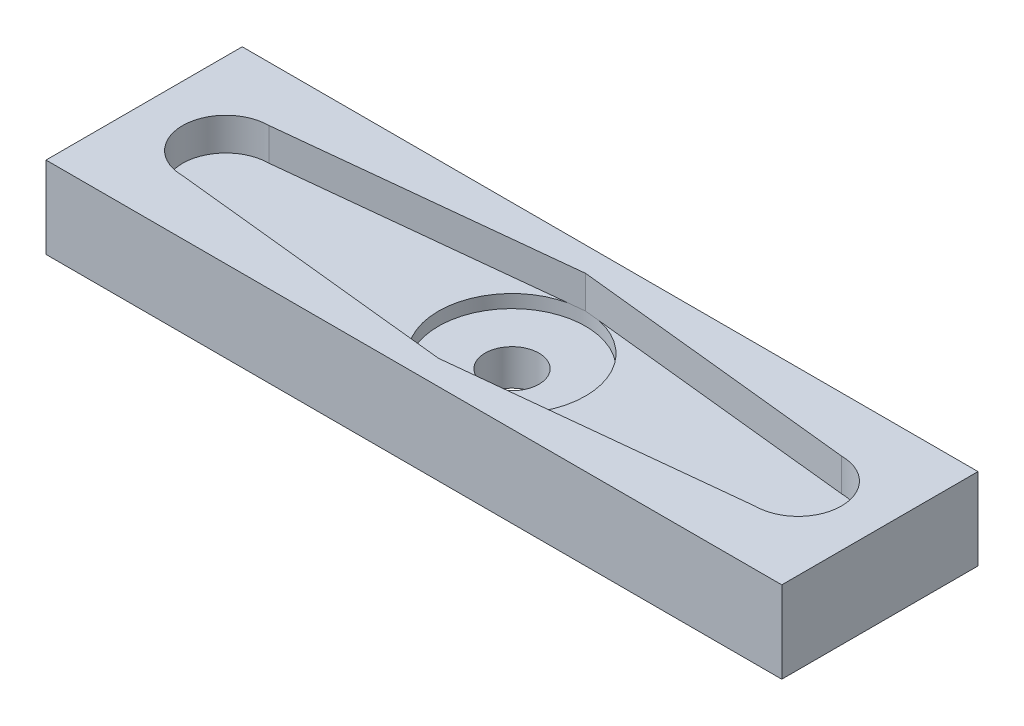
ISO-10303-21;
HEADER;
FILE_DESCRIPTION(('STEP AP214'),'2;1');
FILE_NAME('part.step','',(''),(''),'','','');
FILE_SCHEMA(('AUTOMOTIVE_DESIGN { 1 0 10303 214 1 1 1 1 }'));
ENDSEC;
DATA;
#1=APPLICATION_CONTEXT('core data for automotive mechanical design processes');
#2=APPLICATION_PROTOCOL_DEFINITION('international standard','automotive_design',2000,#1);
#3=PRODUCT_CONTEXT('',#1,'mechanical');
#4=PRODUCT('Part','Part','',(#3));
#5=PRODUCT_RELATED_PRODUCT_CATEGORY('part','',(#4));
#6=PRODUCT_DEFINITION_FORMATION('','',#4);
#7=PRODUCT_DEFINITION_CONTEXT('part definition',#1,'design');
#8=PRODUCT_DEFINITION('design','',#6,#7);
#9=PRODUCT_DEFINITION_SHAPE('','',#8);
#10=(LENGTH_UNIT() NAMED_UNIT(*) SI_UNIT(.MILLI.,.METRE.));
#11=(NAMED_UNIT(*) PLANE_ANGLE_UNIT() SI_UNIT($,.RADIAN.));
#12=(NAMED_UNIT(*) SI_UNIT($,.STERADIAN.) SOLID_ANGLE_UNIT());
#13=UNCERTAINTY_MEASURE_WITH_UNIT(LENGTH_MEASURE(1.E-05),#10,'distance_accuracy_value','');
#14=(GEOMETRIC_REPRESENTATION_CONTEXT(3) GLOBAL_UNCERTAINTY_ASSIGNED_CONTEXT((#13)) GLOBAL_UNIT_ASSIGNED_CONTEXT((#10,
#11,#12)) REPRESENTATION_CONTEXT('',''));
#15=CARTESIAN_POINT('',(0.,0.,0.));
#16=DIRECTION('',(0.,0.,1.));
#17=DIRECTION('',(1.,0.,0.));
#18=AXIS2_PLACEMENT_3D('',#15,#16,#17);
#19=CARTESIAN_POINT('',(0.,3.,0.));
#20=DIRECTION('',(0.,1.,0.));
#21=DIRECTION('',(0.,0.,1.));
#22=AXIS2_PLACEMENT_3D('',#19,#20,#21);
#23=PLANE('',#22);
#24=CARTESIAN_POINT('',(0.,3.,0.));
#25=DIRECTION('',(0.,1.,0.));
#26=DIRECTION('',(0.,0.,1.));
#27=AXIS2_PLACEMENT_3D('',#24,#25,#26);
#28=CIRCLE('',#27,4.5);
#29=CARTESIAN_POINT('',(0.940913384301147,3.,4.40053201365959));
#30=VERTEX_POINT('',#29);
#31=CARTESIAN_POINT('',(0.940913384301147,3.,-4.40053201365959));
#32=VERTEX_POINT('',#31);
#33=EDGE_CURVE('E147',#30,#32,#28,.T.);
#34=ORIENTED_EDGE('',*,*,#33,.F.);
#35=DIRECTION('',(0.994458647464907,0.,-0.105128485589147));
#36=VECTOR('',#35,1.);
#37=CARTESIAN_POINT('',(0.470456692150578,3.,4.4502660068298));
#38=LINE('',#37,#36);
#39=CARTESIAN_POINT('',(17.5,3.,2.65));
#40=VERTEX_POINT('',#39);
#41=EDGE_CURVE('E162',#30,#40,#38,.T.);
#42=ORIENTED_EDGE('',*,*,#41,.T.);
#43=CARTESIAN_POINT('',(17.5,3.,0.));
#44=DIRECTION('',(0.,1.,0.));
#45=DIRECTION('',(0.,0.,1.));
#46=AXIS2_PLACEMENT_3D('',#43,#44,#45);
#47=CIRCLE('',#46,2.65);
#48=CARTESIAN_POINT('',(17.5,3.,-2.65));
#49=VERTEX_POINT('',#48);
#50=EDGE_CURVE('E163',#40,#49,#47,.T.);
#51=ORIENTED_EDGE('',*,*,#50,.T.);
#52=DIRECTION('',(0.994458647464907,0.,0.105128485589147));
#53=VECTOR('',#52,1.);
#54=CARTESIAN_POINT('',(0.470456692150578,3.,-4.4502660068298));
#55=LINE('',#54,#53);
#56=EDGE_CURVE('E166',#32,#49,#55,.T.);
#57=ORIENTED_EDGE('',*,*,#56,.F.);
#58=EDGE_LOOP('',(#34,#42,#51,#57));
#59=FACE_BOUND('',#58,.T.);
#60=ADVANCED_FACE('F32',(#59),#23,.T.);
#61=CARTESIAN_POINT('',(0.,-9.,0.));
#62=DIRECTION('',(0.,1.,0.));
#63=DIRECTION('',(0.,0.,1.));
#64=AXIS2_PLACEMENT_3D('',#61,#62,#63);
#65=CYLINDRICAL_SURFACE('',#64,1.65);
#66=CARTESIAN_POINT('',(0.,0.,0.));
#67=DIRECTION('',(0.,1.,0.));
#68=DIRECTION('',(0.,0.,1.));
#69=AXIS2_PLACEMENT_3D('',#66,#67,#68);
#70=CIRCLE('',#69,1.65);
#71=CARTESIAN_POINT('',(0.,0.,1.65));
#72=VERTEX_POINT('',#71);
#73=EDGE_CURVE('E179',#72,#72,#70,.T.);
#74=ORIENTED_EDGE('',*,*,#73,.F.);
#75=EDGE_LOOP('',(#74));
#76=FACE_BOUND('',#75,.T.);
#77=CARTESIAN_POINT('',(0.,2.2,0.));
#78=DIRECTION('',(0.,1.,0.));
#79=DIRECTION('',(0.,0.,1.));
#80=AXIS2_PLACEMENT_3D('',#77,#78,#79);
#81=CIRCLE('',#80,1.65);
#82=CARTESIAN_POINT('',(0.,2.2,1.65));
#83=VERTEX_POINT('',#82);
#84=EDGE_CURVE('E36',#83,#83,#81,.F.);
#85=ORIENTED_EDGE('',*,*,#84,.F.);
#86=EDGE_LOOP('',(#85));
#87=FACE_BOUND('',#86,.T.);
#88=ADVANCED_FACE('F253',(#76,#87),#65,.F.);
#89=CARTESIAN_POINT('',(22.5,5.,-6.));
#90=DIRECTION('',(-1.,0.,0.));
#91=DIRECTION('',(0.,0.,1.));
#92=AXIS2_PLACEMENT_3D('',#89,#90,#91);
#93=PLANE('',#92);
#94=DIRECTION('',(0.,0.,-1.));
#95=VECTOR('',#94,1.);
#96=CARTESIAN_POINT('',(22.5,0.,-6.));
#97=LINE('',#96,#95);
#98=CARTESIAN_POINT('',(22.5,0.,6.));
#99=VERTEX_POINT('',#98);
#100=CARTESIAN_POINT('',(22.5,0.,-6.));
#101=VERTEX_POINT('',#100);
#102=EDGE_CURVE('E195',#99,#101,#97,.T.);
#103=ORIENTED_EDGE('',*,*,#102,.T.);
#104=DIRECTION('',(0.,-1.,0.));
#105=VECTOR('',#104,1.);
#106=CARTESIAN_POINT('',(22.5,5.,-6.));
#107=LINE('',#106,#105);
#108=CARTESIAN_POINT('',(22.5,5.,-6.));
#109=VERTEX_POINT('',#108);
#110=EDGE_CURVE('E11',#109,#101,#107,.T.);
#111=ORIENTED_EDGE('',*,*,#110,.F.);
#112=DIRECTION('',(0.,0.,-1.));
#113=VECTOR('',#112,1.);
#114=CARTESIAN_POINT('',(22.5,5.,-6.));
#115=LINE('',#114,#113);
#116=CARTESIAN_POINT('',(22.5,5.,6.));
#117=VERTEX_POINT('',#116);
#118=EDGE_CURVE('E202',#117,#109,#115,.T.);
#119=ORIENTED_EDGE('',*,*,#118,.F.);
#120=DIRECTION('',(0.,-1.,0.));
#121=VECTOR('',#120,1.);
#122=CARTESIAN_POINT('',(22.5,5.,6.));
#123=LINE('',#122,#121);
#124=EDGE_CURVE('E212',#117,#99,#123,.T.);
#125=ORIENTED_EDGE('',*,*,#124,.T.);
#126=EDGE_LOOP('',(#103,#111,#119,#125));
#127=FACE_BOUND('',#126,.T.);
#128=ADVANCED_FACE('F34',(#127),#93,.F.);
#129=CARTESIAN_POINT('',(-22.5,5.,-6.));
#130=DIRECTION('',(0.,0.,1.));
#131=DIRECTION('',(1.,0.,0.));
#132=AXIS2_PLACEMENT_3D('',#129,#130,#131);
#133=PLANE('',#132);
#134=DIRECTION('',(-1.,0.,0.));
#135=VECTOR('',#134,1.);
#136=CARTESIAN_POINT('',(-22.5,0.,-6.));
#137=LINE('',#136,#135);
#138=CARTESIAN_POINT('',(-22.5,0.,-6.));
#139=VERTEX_POINT('',#138);
#140=EDGE_CURVE('E215',#101,#139,#137,.T.);
#141=ORIENTED_EDGE('',*,*,#140,.T.);
#142=DIRECTION('',(0.,-1.,0.));
#143=VECTOR('',#142,1.);
#144=CARTESIAN_POINT('',(-22.5,5.,-6.));
#145=LINE('',#144,#143);
#146=CARTESIAN_POINT('',(-22.5,5.,-6.));
#147=VERTEX_POINT('',#146);
#148=EDGE_CURVE('E41',#147,#139,#145,.T.);
#149=ORIENTED_EDGE('',*,*,#148,.F.);
#150=DIRECTION('',(-1.,0.,0.));
#151=VECTOR('',#150,1.);
#152=CARTESIAN_POINT('',(-22.5,5.,-6.));
#153=LINE('',#152,#151);
#154=EDGE_CURVE('E205',#109,#147,#153,.T.);
#155=ORIENTED_EDGE('',*,*,#154,.F.);
#156=ORIENTED_EDGE('',*,*,#110,.T.);
#157=EDGE_LOOP('',(#141,#149,#155,#156));
#158=FACE_BOUND('',#157,.T.);
#159=ADVANCED_FACE('F246',(#158),#133,.F.);
#160=CARTESIAN_POINT('',(-22.5,5.,-6.));
#161=DIRECTION('',(1.,0.,0.));
#162=DIRECTION('',(0.,0.,-1.));
#163=AXIS2_PLACEMENT_3D('',#160,#161,#162);
#164=PLANE('',#163);
#165=DIRECTION('',(0.,0.,1.));
#166=VECTOR('',#165,1.);
#167=CARTESIAN_POINT('',(-22.5,0.,-6.));
#168=LINE('',#167,#166);
#169=CARTESIAN_POINT('',(-22.5,0.,6.));
#170=VERTEX_POINT('',#169);
#171=EDGE_CURVE('E217',#139,#170,#168,.T.);
#172=ORIENTED_EDGE('',*,*,#171,.T.);
#173=DIRECTION('',(0.,-1.,0.));
#174=VECTOR('',#173,1.);
#175=CARTESIAN_POINT('',(-22.5,5.,6.));
#176=LINE('',#175,#174);
#177=CARTESIAN_POINT('',(-22.5,5.,6.));
#178=VERTEX_POINT('',#177);
#179=EDGE_CURVE('E222',#178,#170,#176,.T.);
#180=ORIENTED_EDGE('',*,*,#179,.F.);
#181=DIRECTION('',(0.,0.,1.));
#182=VECTOR('',#181,1.);
#183=CARTESIAN_POINT('',(-22.5,5.,-6.));
#184=LINE('',#183,#182);
#185=EDGE_CURVE('E208',#147,#178,#184,.T.);
#186=ORIENTED_EDGE('',*,*,#185,.F.);
#187=ORIENTED_EDGE('',*,*,#148,.T.);
#188=EDGE_LOOP('',(#172,#180,#186,#187));
#189=FACE_BOUND('',#188,.T.);
#190=ADVANCED_FACE('F230',(#189),#164,.F.);
#191=CARTESIAN_POINT('',(-22.5,5.,6.));
#192=DIRECTION('',(0.,0.,-1.));
#193=DIRECTION('',(-1.,0.,0.));
#194=AXIS2_PLACEMENT_3D('',#191,#192,#193);
#195=PLANE('',#194);
#196=DIRECTION('',(1.,0.,0.));
#197=VECTOR('',#196,1.);
#198=CARTESIAN_POINT('',(-22.5,0.,6.));
#199=LINE('',#198,#197);
#200=EDGE_CURVE('E206',#170,#99,#199,.T.);
#201=ORIENTED_EDGE('',*,*,#200,.T.);
#202=ORIENTED_EDGE('',*,*,#124,.F.);
#203=DIRECTION('',(1.,0.,0.));
#204=VECTOR('',#203,1.);
#205=CARTESIAN_POINT('',(-22.5,5.,6.));
#206=LINE('',#205,#204);
#207=EDGE_CURVE('E210',#178,#117,#206,.T.);
#208=ORIENTED_EDGE('',*,*,#207,.F.);
#209=ORIENTED_EDGE('',*,*,#179,.T.);
#210=EDGE_LOOP('',(#201,#202,#208,#209));
#211=FACE_BOUND('',#210,.T.);
#212=ADVANCED_FACE('F239',(#211),#195,.F.);
#213=CARTESIAN_POINT('',(0.,5.,0.));
#214=DIRECTION('',(0.,1.,0.));
#215=DIRECTION('',(0.,0.,1.));
#216=AXIS2_PLACEMENT_3D('',#213,#214,#215);
#217=PLANE('',#216);
#218=CARTESIAN_POINT('',(-17.5,5.,0.));
#219=DIRECTION('',(0.,1.,0.));
#220=DIRECTION('',(0.,0.,1.));
#221=AXIS2_PLACEMENT_3D('',#218,#219,#220);
#222=CIRCLE('',#221,2.65);
#223=CARTESIAN_POINT('',(-17.5,5.,-2.65));
#224=VERTEX_POINT('',#223);
#225=CARTESIAN_POINT('',(-17.5,5.,2.65));
#226=VERTEX_POINT('',#225);
#227=EDGE_CURVE('E56',#224,#226,#222,.T.);
#228=ORIENTED_EDGE('',*,*,#227,.F.);
#229=DIRECTION('',(0.994458647464907,0.,-0.105128485589147));
#230=VECTOR('',#229,1.);
#231=CARTESIAN_POINT('',(-0.470456692150578,5.,-4.4502660068298));
#232=LINE('',#231,#230);
#233=CARTESIAN_POINT('',(0.,5.,-4.5));
#234=VERTEX_POINT('',#233);
#235=EDGE_CURVE('E189',#224,#234,#232,.T.);
#236=ORIENTED_EDGE('',*,*,#235,.T.);
#237=DIRECTION('',(0.994458647464907,0.,0.105128485589147));
#238=VECTOR('',#237,1.);
#239=CARTESIAN_POINT('',(0.470456692150578,5.,-4.4502660068298));
#240=LINE('',#239,#238);
#241=CARTESIAN_POINT('',(17.5,5.,-2.65));
#242=VERTEX_POINT('',#241);
#243=EDGE_CURVE('E186',#234,#242,#240,.T.);
#244=ORIENTED_EDGE('',*,*,#243,.T.);
#245=CARTESIAN_POINT('',(17.5,5.,0.));
#246=DIRECTION('',(0.,1.,0.));
#247=DIRECTION('',(0.,0.,1.));
#248=AXIS2_PLACEMENT_3D('',#245,#246,#247);
#249=CIRCLE('',#248,2.65);
#250=CARTESIAN_POINT('',(17.5,5.,2.65));
#251=VERTEX_POINT('',#250);
#252=EDGE_CURVE('E183',#251,#242,#249,.T.);
#253=ORIENTED_EDGE('',*,*,#252,.F.);
#254=DIRECTION('',(0.994458647464907,0.,-0.105128485589147));
#255=VECTOR('',#254,1.);
#256=CARTESIAN_POINT('',(0.470456692150578,5.,4.4502660068298));
#257=LINE('',#256,#255);
#258=CARTESIAN_POINT('',(0.,5.,4.5));
#259=VERTEX_POINT('',#258);
#260=EDGE_CURVE('E181',#259,#251,#257,.T.);
#261=ORIENTED_EDGE('',*,*,#260,.F.);
#262=DIRECTION('',(0.994458647464907,0.,0.105128485589147));
#263=VECTOR('',#262,1.);
#264=CARTESIAN_POINT('',(-0.470456692150578,5.,4.4502660068298));
#265=LINE('',#264,#263);
#266=EDGE_CURVE('E152',#226,#259,#265,.T.);
#267=ORIENTED_EDGE('',*,*,#266,.F.);
#268=EDGE_LOOP('',(#228,#236,#244,#253,#261,#267));
#269=FACE_BOUND('',#268,.T.);
#270=ORIENTED_EDGE('',*,*,#118,.T.);
#271=ORIENTED_EDGE('',*,*,#154,.T.);
#272=ORIENTED_EDGE('',*,*,#185,.T.);
#273=ORIENTED_EDGE('',*,*,#207,.T.);
#274=EDGE_LOOP('',(#270,#271,#272,#273));
#275=FACE_BOUND('',#274,.T.);
#276=ADVANCED_FACE('F245',(#269,#275),#217,.T.);
#277=CARTESIAN_POINT('',(0.,0.,0.));
#278=DIRECTION('',(0.,1.,0.));
#279=DIRECTION('',(0.,0.,1.));
#280=AXIS2_PLACEMENT_3D('',#277,#278,#279);
#281=PLANE('',#280);
#282=ORIENTED_EDGE('',*,*,#73,.T.);
#283=EDGE_LOOP('',(#282));
#284=FACE_BOUND('',#283,.T.);
#285=ORIENTED_EDGE('',*,*,#102,.F.);
#286=ORIENTED_EDGE('',*,*,#200,.F.);
#287=ORIENTED_EDGE('',*,*,#171,.F.);
#288=ORIENTED_EDGE('',*,*,#140,.F.);
#289=EDGE_LOOP('',(#285,#286,#287,#288));
#290=FACE_BOUND('',#289,.T.);
#291=ADVANCED_FACE('F236',(#284,#290),#281,.F.);
#292=CARTESIAN_POINT('',(-17.5,3.,0.));
#293=DIRECTION('',(0.,1.,0.));
#294=DIRECTION('',(0.,0.,1.));
#295=AXIS2_PLACEMENT_3D('',#292,#293,#294);
#296=CYLINDRICAL_SURFACE('',#295,2.65);
#297=ORIENTED_EDGE('',*,*,#227,.T.);
#298=DIRECTION('',(0.,1.,0.));
#299=VECTOR('',#298,1.);
#300=CARTESIAN_POINT('',(-17.5,3.,2.65));
#301=LINE('',#300,#299);
#302=CARTESIAN_POINT('',(-17.5,3.,2.65));
#303=VERTEX_POINT('',#302);
#304=EDGE_CURVE('E157',#303,#226,#301,.T.);
#305=ORIENTED_EDGE('',*,*,#304,.F.);
#306=CARTESIAN_POINT('',(-17.5,3.,0.));
#307=DIRECTION('',(0.,1.,0.));
#308=DIRECTION('',(0.,0.,1.));
#309=AXIS2_PLACEMENT_3D('',#306,#307,#308);
#310=CIRCLE('',#309,2.65);
#311=CARTESIAN_POINT('',(-17.5,3.,-2.65));
#312=VERTEX_POINT('',#311);
#313=EDGE_CURVE('E192',#312,#303,#310,.T.);
#314=ORIENTED_EDGE('',*,*,#313,.F.);
#315=DIRECTION('',(0.,1.,0.));
#316=VECTOR('',#315,1.);
#317=CARTESIAN_POINT('',(-17.5,3.,-2.65));
#318=LINE('',#317,#316);
#319=EDGE_CURVE('E193',#312,#224,#318,.T.);
#320=ORIENTED_EDGE('',*,*,#319,.T.);
#321=EDGE_LOOP('',(#297,#305,#314,#320));
#322=FACE_BOUND('',#321,.T.);
#323=ADVANCED_FACE('F283',(#322),#296,.F.);
#324=CARTESIAN_POINT('',(-0.470456692150578,3.,-4.4502660068298));
#325=DIRECTION('',(0.105128485589147,0.,0.994458647464907));
#326=DIRECTION('',(0.994458647464907,0.,-0.105128485589147));
#327=AXIS2_PLACEMENT_3D('',#324,#325,#326);
#328=PLANE('',#327);
#329=ORIENTED_EDGE('',*,*,#235,.F.);
#330=ORIENTED_EDGE('',*,*,#319,.F.);
#331=DIRECTION('',(0.994458647464907,0.,-0.105128485589147));
#332=VECTOR('',#331,1.);
#333=CARTESIAN_POINT('',(-0.470456692150578,3.,-4.4502660068298));
#334=LINE('',#333,#332);
#335=CARTESIAN_POINT('',(-0.940913384301147,3.,-4.4005320136596));
#336=VERTEX_POINT('',#335);
#337=EDGE_CURVE('E175',#312,#336,#334,.T.);
#338=ORIENTED_EDGE('',*,*,#337,.T.);
#339=DIRECTION('',(-0.994458647464907,0.,0.105128485589147));
#340=VECTOR('',#339,1.);
#341=CARTESIAN_POINT('',(-0.470456692150578,3.,-4.4502660068298));
#342=LINE('',#341,#340);
#343=CARTESIAN_POINT('',(0.,3.,-4.5));
#344=VERTEX_POINT('',#343);
#345=EDGE_CURVE('E131',#344,#336,#342,.T.);
#346=ORIENTED_EDGE('',*,*,#345,.F.);
#347=DIRECTION('',(0.,1.,0.));
#348=VECTOR('',#347,1.);
#349=CARTESIAN_POINT('',(0.,3.,-4.5));
#350=LINE('',#349,#348);
#351=EDGE_CURVE('E196',#344,#234,#350,.T.);
#352=ORIENTED_EDGE('',*,*,#351,.T.);
#353=EDGE_LOOP('',(#329,#330,#338,#346,#352));
#354=FACE_BOUND('',#353,.T.);
#355=ADVANCED_FACE('F281',(#354),#328,.T.);
#356=CARTESIAN_POINT('',(0.470456692150578,3.,-4.4502660068298));
#357=DIRECTION('',(-0.105128485589147,0.,0.994458647464907));
#358=DIRECTION('',(0.994458647464907,0.,0.105128485589147));
#359=AXIS2_PLACEMENT_3D('',#356,#357,#358);
#360=PLANE('',#359);
#361=ORIENTED_EDGE('',*,*,#243,.F.);
#362=ORIENTED_EDGE('',*,*,#351,.F.);
#363=EDGE_CURVE('E172',#344,#32,#55,.T.);
#364=ORIENTED_EDGE('',*,*,#363,.T.);
#365=ORIENTED_EDGE('',*,*,#56,.T.);
#366=DIRECTION('',(0.,1.,0.));
#367=VECTOR('',#366,1.);
#368=CARTESIAN_POINT('',(17.5,3.,-2.65));
#369=LINE('',#368,#367);
#370=EDGE_CURVE('E198',#49,#242,#369,.T.);
#371=ORIENTED_EDGE('',*,*,#370,.T.);
#372=EDGE_LOOP('',(#361,#362,#364,#365,#371));
#373=FACE_BOUND('',#372,.T.);
#374=ADVANCED_FACE('F309',(#373),#360,.T.);
#375=CARTESIAN_POINT('',(17.5,3.,0.));
#376=DIRECTION('',(0.,1.,0.));
#377=DIRECTION('',(0.,0.,1.));
#378=AXIS2_PLACEMENT_3D('',#375,#376,#377);
#379=CYLINDRICAL_SURFACE('',#378,2.65);
#380=ORIENTED_EDGE('',*,*,#252,.T.);
#381=ORIENTED_EDGE('',*,*,#370,.F.);
#382=ORIENTED_EDGE('',*,*,#50,.F.);
#383=DIRECTION('',(0.,1.,0.));
#384=VECTOR('',#383,1.);
#385=CARTESIAN_POINT('',(17.5,3.,2.65));
#386=LINE('',#385,#384);
#387=EDGE_CURVE('E156',#40,#251,#386,.T.);
#388=ORIENTED_EDGE('',*,*,#387,.T.);
#389=EDGE_LOOP('',(#380,#381,#382,#388));
#390=FACE_BOUND('',#389,.T.);
#391=ADVANCED_FACE('F315',(#390),#379,.F.);
#392=CARTESIAN_POINT('',(0.470456692150578,3.,4.4502660068298));
#393=DIRECTION('',(0.105128485589147,0.,0.994458647464907));
#394=DIRECTION('',(0.994458647464907,0.,-0.105128485589147));
#395=AXIS2_PLACEMENT_3D('',#392,#393,#394);
#396=PLANE('',#395);
#397=ORIENTED_EDGE('',*,*,#260,.T.);
#398=ORIENTED_EDGE('',*,*,#387,.F.);
#399=ORIENTED_EDGE('',*,*,#41,.F.);
#400=CARTESIAN_POINT('',(0.,3.,4.5));
#401=VERTEX_POINT('',#400);
#402=EDGE_CURVE('E146',#401,#30,#38,.T.);
#403=ORIENTED_EDGE('',*,*,#402,.F.);
#404=DIRECTION('',(0.,1.,0.));
#405=VECTOR('',#404,1.);
#406=CARTESIAN_POINT('',(0.,3.,4.5));
#407=LINE('',#406,#405);
#408=EDGE_CURVE('E149',#401,#259,#407,.T.);
#409=ORIENTED_EDGE('',*,*,#408,.T.);
#410=EDGE_LOOP('',(#397,#398,#399,#403,#409));
#411=FACE_BOUND('',#410,.T.);
#412=ADVANCED_FACE('F160',(#411),#396,.F.);
#413=CARTESIAN_POINT('',(-0.470456692150578,3.,4.4502660068298));
#414=DIRECTION('',(-0.105128485589147,0.,0.994458647464907));
#415=DIRECTION('',(0.994458647464907,0.,0.105128485589147));
#416=AXIS2_PLACEMENT_3D('',#413,#414,#415);
#417=PLANE('',#416);
#418=ORIENTED_EDGE('',*,*,#266,.T.);
#419=ORIENTED_EDGE('',*,*,#408,.F.);
#420=DIRECTION('',(-0.994458647464907,0.,-0.105128485589147));
#421=VECTOR('',#420,1.);
#422=CARTESIAN_POINT('',(-0.470456692150578,3.,4.4502660068298));
#423=LINE('',#422,#421);
#424=CARTESIAN_POINT('',(-0.940913384301147,3.,4.40053201365959));
#425=VERTEX_POINT('',#424);
#426=EDGE_CURVE('E123',#401,#425,#423,.T.);
#427=ORIENTED_EDGE('',*,*,#426,.T.);
#428=DIRECTION('',(0.994458647464907,0.,0.105128485589147));
#429=VECTOR('',#428,1.);
#430=CARTESIAN_POINT('',(-0.470456692150578,3.,4.4502660068298));
#431=LINE('',#430,#429);
#432=EDGE_CURVE('E168',#303,#425,#431,.T.);
#433=ORIENTED_EDGE('',*,*,#432,.F.);
#434=ORIENTED_EDGE('',*,*,#304,.T.);
#435=EDGE_LOOP('',(#418,#419,#427,#433,#434));
#436=FACE_BOUND('',#435,.T.);
#437=ADVANCED_FACE('F150',(#436),#417,.F.);
#438=EDGE_CURVE('E141',#336,#425,#28,.T.);
#439=ORIENTED_EDGE('',*,*,#438,.F.);
#440=ORIENTED_EDGE('',*,*,#337,.F.);
#441=ORIENTED_EDGE('',*,*,#313,.T.);
#442=ORIENTED_EDGE('',*,*,#432,.T.);
#443=EDGE_LOOP('',(#439,#440,#441,#442));
#444=FACE_BOUND('',#443,.T.);
#445=ADVANCED_FACE('F257',(#444),#23,.T.);
#446=CARTESIAN_POINT('',(0.,2.2,0.));
#447=DIRECTION('',(0.,1.,0.));
#448=DIRECTION('',(0.,0.,1.));
#449=AXIS2_PLACEMENT_3D('',#446,#447,#448);
#450=PLANE('',#449);
#451=CARTESIAN_POINT('',(0.,2.2,0.));
#452=DIRECTION('',(0.,1.,0.));
#453=DIRECTION('',(0.,0.,1.));
#454=AXIS2_PLACEMENT_3D('',#451,#452,#453);
#455=CIRCLE('',#454,4.5);
#456=CARTESIAN_POINT('',(0.,2.2,4.5));
#457=VERTEX_POINT('',#456);
#458=EDGE_CURVE('E132',#457,#457,#455,.T.);
#459=ORIENTED_EDGE('',*,*,#458,.T.);
#460=EDGE_LOOP('',(#459));
#461=FACE_BOUND('',#460,.T.);
#462=ORIENTED_EDGE('',*,*,#84,.T.);
#463=EDGE_LOOP('',(#462));
#464=FACE_BOUND('',#463,.T.);
#465=ADVANCED_FACE('F265',(#461,#464),#450,.T.);
#466=CARTESIAN_POINT('',(0.,3.,0.));
#467=DIRECTION('',(0.,1.,0.));
#468=DIRECTION('',(0.,0.,1.));
#469=AXIS2_PLACEMENT_3D('',#466,#467,#468);
#470=PLANE('',#469);
#471=ORIENTED_EDGE('',*,*,#345,.T.);
#472=EDGE_CURVE('E48',#344,#336,#28,.T.);
#473=ORIENTED_EDGE('',*,*,#472,.F.);
#474=EDGE_LOOP('',(#471,#473));
#475=FACE_BOUND('',#474,.T.);
#476=ADVANCED_FACE('F271',(#475),#470,.F.);
#477=EDGE_CURVE('E138',#401,#30,#28,.T.);
#478=ORIENTED_EDGE('',*,*,#477,.F.);
#479=ORIENTED_EDGE('',*,*,#402,.T.);
#480=EDGE_LOOP('',(#478,#479));
#481=FACE_BOUND('',#480,.T.);
#482=ADVANCED_FACE('F144',(#481),#470,.F.);
#483=EDGE_CURVE('E126',#425,#401,#28,.T.);
#484=ORIENTED_EDGE('',*,*,#483,.F.);
#485=ORIENTED_EDGE('',*,*,#426,.F.);
#486=EDGE_LOOP('',(#484,#485));
#487=FACE_BOUND('',#486,.T.);
#488=ADVANCED_FACE('F125',(#487),#470,.F.);
#489=ORIENTED_EDGE('',*,*,#363,.F.);
#490=EDGE_CURVE('E305',#32,#344,#28,.T.);
#491=ORIENTED_EDGE('',*,*,#490,.F.);
#492=EDGE_LOOP('',(#489,#491));
#493=FACE_BOUND('',#492,.T.);
#494=ADVANCED_FACE('F293',(#493),#470,.F.);
#495=CARTESIAN_POINT('',(0.,2.2,0.));
#496=DIRECTION('',(0.,1.,0.));
#497=DIRECTION('',(0.,0.,1.));
#498=AXIS2_PLACEMENT_3D('',#495,#496,#497);
#499=CYLINDRICAL_SURFACE('',#498,4.5);
#500=ORIENTED_EDGE('',*,*,#458,.F.);
#501=EDGE_LOOP('',(#500));
#502=FACE_BOUND('',#501,.T.);
#503=ORIENTED_EDGE('',*,*,#477,.T.);
#504=ORIENTED_EDGE('',*,*,#33,.T.);
#505=ORIENTED_EDGE('',*,*,#490,.T.);
#506=ORIENTED_EDGE('',*,*,#472,.T.);
#507=ORIENTED_EDGE('',*,*,#438,.T.);
#508=ORIENTED_EDGE('',*,*,#483,.T.);
#509=EDGE_LOOP('',(#503,#504,#505,#506,#507,#508));
#510=FACE_BOUND('',#509,.T.);
#511=ADVANCED_FACE('F136',(#502,#510),#499,.F.);
#512=CLOSED_SHELL('',(#60,#88,#128,#159,#190,#212,#276,#291,#323,#355,#374,#391,#412,#437,#445,
#465,#476,#482,#488,#494,#511));
#513=MANIFOLD_SOLID_BREP('B2',#512);
#514=ADVANCED_BREP_SHAPE_REPRESENTATION('',(#18,#513),#14);
#515=SHAPE_DEFINITION_REPRESENTATION(#9,#514);
ENDSEC;
END-ISO-10303-21;
